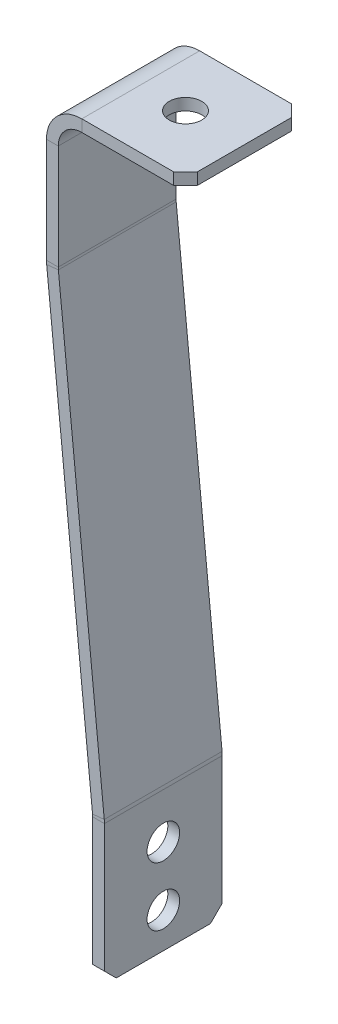
ISO-10303-21;
HEADER;
FILE_DESCRIPTION(('STEP AP214'),'2;1');
FILE_NAME('part.step','',(''),(''),'','','');
FILE_SCHEMA(('AUTOMOTIVE_DESIGN { 1 0 10303 214 1 1 1 1 }'));
ENDSEC;
DATA;
#1=APPLICATION_CONTEXT('core data for automotive mechanical design processes');
#2=APPLICATION_PROTOCOL_DEFINITION('international standard','automotive_design',2000,#1);
#3=PRODUCT_CONTEXT('',#1,'mechanical');
#4=PRODUCT('Part','Part','',(#3));
#5=PRODUCT_RELATED_PRODUCT_CATEGORY('part','',(#4));
#6=PRODUCT_DEFINITION_FORMATION('','',#4);
#7=PRODUCT_DEFINITION_CONTEXT('part definition',#1,'design');
#8=PRODUCT_DEFINITION('design','',#6,#7);
#9=PRODUCT_DEFINITION_SHAPE('','',#8);
#10=(LENGTH_UNIT() NAMED_UNIT(*) SI_UNIT(.MILLI.,.METRE.));
#11=(NAMED_UNIT(*) PLANE_ANGLE_UNIT() SI_UNIT($,.RADIAN.));
#12=(NAMED_UNIT(*) SI_UNIT($,.STERADIAN.) SOLID_ANGLE_UNIT());
#13=UNCERTAINTY_MEASURE_WITH_UNIT(LENGTH_MEASURE(1.E-05),#10,'distance_accuracy_value','');
#14=(GEOMETRIC_REPRESENTATION_CONTEXT(3) GLOBAL_UNCERTAINTY_ASSIGNED_CONTEXT((#13)) GLOBAL_UNIT_ASSIGNED_CONTEXT((#10,
#11,#12)) REPRESENTATION_CONTEXT('',''));
#15=CARTESIAN_POINT('',(0.,0.,0.));
#16=DIRECTION('',(0.,0.,1.));
#17=DIRECTION('',(1.,0.,0.));
#18=AXIS2_PLACEMENT_3D('',#15,#16,#17);
#19=CARTESIAN_POINT('',(-19.6,298.5,50.));
#20=DIRECTION('',(0.,0.,1.));
#21=DIRECTION('',(1.,0.,0.));
#22=AXIS2_PLACEMENT_3D('',#19,#20,#21);
#23=PLANE('',#22);
#24=DIRECTION('',(-1.,0.,0.));
#25=VECTOR('',#24,1.);
#26=CARTESIAN_POINT('',(-19.6,298.5,50.));
#27=LINE('',#26,#25);
#28=CARTESIAN_POINT('',(-19.6,298.5,50.));
#29=VERTEX_POINT('',#28);
#30=CARTESIAN_POINT('',(-24.6,298.5,50.));
#31=VERTEX_POINT('',#30);
#32=EDGE_CURVE('E344',#29,#31,#27,.T.);
#33=ORIENTED_EDGE('',*,*,#32,.F.);
#34=CARTESIAN_POINT('',(-9.60000000000002,298.5,50.));
#35=DIRECTION('',(0.,0.,-1.));
#36=DIRECTION('',(-1.,0.,0.));
#37=AXIS2_PLACEMENT_3D('',#34,#35,#36);
#38=CIRCLE('',#37,10.);
#39=CARTESIAN_POINT('',(-9.60000000000002,308.5,50.));
#40=VERTEX_POINT('',#39);
#41=EDGE_CURVE('E228',#40,#29,#38,.F.);
#42=ORIENTED_EDGE('',*,*,#41,.F.);
#43=DIRECTION('',(0.,-1.,0.));
#44=VECTOR('',#43,1.);
#45=CARTESIAN_POINT('',(-9.60000000000002,313.5,50.));
#46=LINE('',#45,#44);
#47=CARTESIAN_POINT('',(-9.60000000000002,313.5,50.));
#48=VERTEX_POINT('',#47);
#49=EDGE_CURVE('E341',#48,#40,#46,.T.);
#50=ORIENTED_EDGE('',*,*,#49,.F.);
#51=CARTESIAN_POINT('',(-9.60000000000002,298.5,50.));
#52=DIRECTION('',(0.,0.,1.));
#53=DIRECTION('',(1.,0.,0.));
#54=AXIS2_PLACEMENT_3D('',#51,#52,#53);
#55=CIRCLE('',#54,15.);
#56=EDGE_CURVE('E235',#48,#31,#55,.T.);
#57=ORIENTED_EDGE('',*,*,#56,.T.);
#58=EDGE_LOOP('',(#33,#42,#50,#57));
#59=FACE_BOUND('',#58,.T.);
#60=ADVANCED_FACE('F47',(#59),#23,.T.);
#61=CARTESIAN_POINT('',(-9.60000000000002,313.5,50.));
#62=DIRECTION('',(0.,0.,1.));
#63=DIRECTION('',(1.,0.,0.));
#64=AXIS2_PLACEMENT_3D('',#61,#62,#63);
#65=PLANE('',#64);
#66=DIRECTION('',(0.,-1.,0.));
#67=VECTOR('',#66,1.);
#68=CARTESIAN_POINT('',(-19.6,308.5,50.));
#69=LINE('',#68,#67);
#70=CARTESIAN_POINT('',(-19.6,254.005167491933,50.));
#71=VERTEX_POINT('',#70);
#72=EDGE_CURVE('E225',#29,#71,#69,.T.);
#73=ORIENTED_EDGE('',*,*,#72,.F.);
#74=ORIENTED_EDGE('',*,*,#32,.T.);
#75=DIRECTION('',(0.,-1.,0.));
#76=VECTOR('',#75,1.);
#77=CARTESIAN_POINT('',(-24.6,308.5,50.));
#78=LINE('',#77,#76);
#79=CARTESIAN_POINT('',(-24.6,254.005167491933,50.));
#80=VERTEX_POINT('',#79);
#81=EDGE_CURVE('E238',#31,#80,#78,.T.);
#82=ORIENTED_EDGE('',*,*,#81,.T.);
#83=DIRECTION('',(1.,0.,0.));
#84=VECTOR('',#83,1.);
#85=CARTESIAN_POINT('',(-24.6,254.005167491933,50.));
#86=LINE('',#85,#84);
#87=EDGE_CURVE('E332',#80,#71,#86,.T.);
#88=ORIENTED_EDGE('',*,*,#87,.T.);
#89=EDGE_LOOP('',(#73,#74,#82,#88));
#90=FACE_BOUND('',#89,.T.);
#91=ADVANCED_FACE('F493',(#90),#65,.T.);
#92=CARTESIAN_POINT('',(-9.60000000000002,308.5,0.));
#93=DIRECTION('',(0.,0.,-1.));
#94=DIRECTION('',(-1.,0.,0.));
#95=AXIS2_PLACEMENT_3D('',#92,#93,#94);
#96=PLANE('',#95);
#97=DIRECTION('',(0.,1.,0.));
#98=VECTOR('',#97,1.);
#99=CARTESIAN_POINT('',(-9.60000000000002,308.5,0.));
#100=LINE('',#99,#98);
#101=CARTESIAN_POINT('',(-9.60000000000002,308.5,0.));
#102=VERTEX_POINT('',#101);
#103=CARTESIAN_POINT('',(-9.60000000000002,313.5,0.));
#104=VERTEX_POINT('',#103);
#105=EDGE_CURVE('E338',#102,#104,#100,.T.);
#106=ORIENTED_EDGE('',*,*,#105,.F.);
#107=CARTESIAN_POINT('',(-9.60000000000002,298.5,0.));
#108=DIRECTION('',(0.,0.,-1.));
#109=DIRECTION('',(-1.,0.,0.));
#110=AXIS2_PLACEMENT_3D('',#107,#108,#109);
#111=CIRCLE('',#110,10.);
#112=CARTESIAN_POINT('',(-19.6,298.5,0.));
#113=VERTEX_POINT('',#112);
#114=EDGE_CURVE('E265',#102,#113,#111,.F.);
#115=ORIENTED_EDGE('',*,*,#114,.T.);
#116=DIRECTION('',(1.,0.,0.));
#117=VECTOR('',#116,1.);
#118=CARTESIAN_POINT('',(-24.6,298.5,0.));
#119=LINE('',#118,#117);
#120=CARTESIAN_POINT('',(-24.6,298.5,0.));
#121=VERTEX_POINT('',#120);
#122=EDGE_CURVE('E336',#121,#113,#119,.T.);
#123=ORIENTED_EDGE('',*,*,#122,.F.);
#124=CARTESIAN_POINT('',(-9.60000000000002,298.5,0.));
#125=DIRECTION('',(0.,0.,1.));
#126=DIRECTION('',(1.,0.,0.));
#127=AXIS2_PLACEMENT_3D('',#124,#125,#126);
#128=CIRCLE('',#127,15.);
#129=EDGE_CURVE('E272',#104,#121,#128,.T.);
#130=ORIENTED_EDGE('',*,*,#129,.F.);
#131=EDGE_LOOP('',(#106,#115,#123,#130));
#132=FACE_BOUND('',#131,.T.);
#133=ADVANCED_FACE('F457',(#132),#96,.T.);
#134=CARTESIAN_POINT('',(-24.6,298.5,0.));
#135=DIRECTION('',(0.,0.,-1.));
#136=DIRECTION('',(-1.,0.,0.));
#137=AXIS2_PLACEMENT_3D('',#134,#135,#136);
#138=PLANE('',#137);
#139=DIRECTION('',(1.,0.,0.));
#140=VECTOR('',#139,1.);
#141=CARTESIAN_POINT('',(34.4,313.5,0.));
#142=LINE('',#141,#140);
#143=CARTESIAN_POINT('',(29.4,313.5,0.));
#144=VERTEX_POINT('',#143);
#145=EDGE_CURVE('E270',#144,#104,#142,.F.);
#146=ORIENTED_EDGE('',*,*,#145,.F.);
#147=DIRECTION('',(0.,-1.,0.));
#148=VECTOR('',#147,1.);
#149=CARTESIAN_POINT('',(29.4,298.5,0.));
#150=LINE('',#149,#148);
#151=CARTESIAN_POINT('',(29.4,308.5,0.));
#152=VERTEX_POINT('',#151);
#153=EDGE_CURVE('E346',#144,#152,#150,.T.);
#154=ORIENTED_EDGE('',*,*,#153,.T.);
#155=DIRECTION('',(-1.,0.,0.));
#156=VECTOR('',#155,1.);
#157=CARTESIAN_POINT('',(34.4,308.5,0.));
#158=LINE('',#157,#156);
#159=EDGE_CURVE('E268',#152,#102,#158,.T.);
#160=ORIENTED_EDGE('',*,*,#159,.T.);
#161=ORIENTED_EDGE('',*,*,#105,.T.);
#162=EDGE_LOOP('',(#146,#154,#160,#161));
#163=FACE_BOUND('',#162,.T.);
#164=ADVANCED_FACE('F451',(#163),#138,.T.);
#165=CARTESIAN_POINT('',(-19.5490910776334,252.99740426133,50.));
#166=DIRECTION('',(0.,0.,1.));
#167=DIRECTION('',(1.,0.,0.));
#168=AXIS2_PLACEMENT_3D('',#165,#166,#167);
#169=PLANE('',#168);
#170=DIRECTION('',(-0.994909107763343,-0.10077632306027,0.));
#171=VECTOR('',#170,1.);
#172=CARTESIAN_POINT('',(-19.5490910776334,252.99740426133,50.));
#173=LINE('',#172,#171);
#174=CARTESIAN_POINT('',(-19.5490910776334,252.99740426133,50.));
#175=VERTEX_POINT('',#174);
#176=CARTESIAN_POINT('',(-24.5236366164502,252.493522646029,50.));
#177=VERTEX_POINT('',#176);
#178=EDGE_CURVE('E334',#175,#177,#173,.T.);
#179=ORIENTED_EDGE('',*,*,#178,.F.);
#180=CARTESIAN_POINT('',(-9.60000000000002,254.005167491933,50.));
#181=DIRECTION('',(0.,0.,-1.));
#182=DIRECTION('',(-1.,0.,0.));
#183=AXIS2_PLACEMENT_3D('',#180,#181,#182);
#184=CIRCLE('',#183,10.);
#185=EDGE_CURVE('E219',#71,#175,#184,.F.);
#186=ORIENTED_EDGE('',*,*,#185,.F.);
#187=ORIENTED_EDGE('',*,*,#87,.F.);
#188=CARTESIAN_POINT('',(-9.60000000000002,254.005167491933,50.));
#189=DIRECTION('',(0.,0.,1.));
#190=DIRECTION('',(1.,0.,0.));
#191=AXIS2_PLACEMENT_3D('',#188,#189,#190);
#192=CIRCLE('',#191,15.);
#193=EDGE_CURVE('E241',#80,#177,#192,.T.);
#194=ORIENTED_EDGE('',*,*,#193,.T.);
#195=EDGE_LOOP('',(#179,#186,#187,#194));
#196=FACE_BOUND('',#195,.T.);
#197=ADVANCED_FACE('F491',(#196),#169,.T.);
#198=CARTESIAN_POINT('',(-24.6,254.005167491933,50.));
#199=DIRECTION('',(0.,0.,1.));
#200=DIRECTION('',(1.,0.,0.));
#201=AXIS2_PLACEMENT_3D('',#198,#199,#200);
#202=PLANE('',#201);
#203=DIRECTION('',(0.100776323060266,-0.994909107763344,0.));
#204=VECTOR('',#203,1.);
#205=CARTESIAN_POINT('',(-19.6,253.5,50.));
#206=LINE('',#205,#204);
#207=CARTESIAN_POINT('',(-0.0763633835500037,60.7538936080064,50.));
#208=VERTEX_POINT('',#207);
#209=EDGE_CURVE('E217',#175,#208,#206,.T.);
#210=ORIENTED_EDGE('',*,*,#209,.F.);
#211=ORIENTED_EDGE('',*,*,#178,.T.);
#212=DIRECTION('',(0.100776323060266,-0.994909107763344,0.));
#213=VECTOR('',#212,1.);
#214=CARTESIAN_POINT('',(-24.5745455388167,252.996118384699,50.));
#215=LINE('',#214,#213);
#216=CARTESIAN_POINT('',(-5.05090892236665,60.2500119927051,50.));
#217=VERTEX_POINT('',#216);
#218=EDGE_CURVE('E244',#177,#217,#215,.T.);
#219=ORIENTED_EDGE('',*,*,#218,.T.);
#220=DIRECTION('',(0.994909107763344,0.100776323060269,0.));
#221=VECTOR('',#220,1.);
#222=CARTESIAN_POINT('',(-5.05090892236665,60.2500119927051,50.));
#223=LINE('',#222,#221);
#224=EDGE_CURVE('E194',#217,#208,#223,.T.);
#225=ORIENTED_EDGE('',*,*,#224,.T.);
#226=EDGE_LOOP('',(#210,#211,#219,#225));
#227=FACE_BOUND('',#226,.T.);
#228=ADVANCED_FACE('F770',(#227),#202,.T.);
#229=CARTESIAN_POINT('',(-19.6,254.005167491933,0.));
#230=DIRECTION('',(0.,0.,-1.));
#231=DIRECTION('',(-1.,0.,0.));
#232=AXIS2_PLACEMENT_3D('',#229,#230,#231);
#233=PLANE('',#232);
#234=DIRECTION('',(-1.,0.,0.));
#235=VECTOR('',#234,1.);
#236=CARTESIAN_POINT('',(-19.6,254.005167491933,0.));
#237=LINE('',#236,#235);
#238=CARTESIAN_POINT('',(-19.6,254.005167491933,0.));
#239=VERTEX_POINT('',#238);
#240=CARTESIAN_POINT('',(-24.6,254.005167491933,0.));
#241=VERTEX_POINT('',#240);
#242=EDGE_CURVE('E330',#239,#241,#237,.T.);
#243=ORIENTED_EDGE('',*,*,#242,.F.);
#244=CARTESIAN_POINT('',(-9.60000000000002,254.005167491933,0.));
#245=DIRECTION('',(0.,0.,-1.));
#246=DIRECTION('',(-1.,0.,0.));
#247=AXIS2_PLACEMENT_3D('',#244,#245,#246);
#248=CIRCLE('',#247,10.);
#249=CARTESIAN_POINT('',(-19.5490910776334,252.99740426133,0.));
#250=VERTEX_POINT('',#249);
#251=EDGE_CURVE('E259',#239,#250,#248,.F.);
#252=ORIENTED_EDGE('',*,*,#251,.T.);
#253=DIRECTION('',(0.994909107763343,0.10077632306027,0.));
#254=VECTOR('',#253,1.);
#255=CARTESIAN_POINT('',(-24.5236366164502,252.493522646029,0.));
#256=LINE('',#255,#254);
#257=CARTESIAN_POINT('',(-24.5236366164502,252.493522646029,0.));
#258=VERTEX_POINT('',#257);
#259=EDGE_CURVE('E193',#258,#250,#256,.T.);
#260=ORIENTED_EDGE('',*,*,#259,.F.);
#261=CARTESIAN_POINT('',(-9.60000000000002,254.005167491933,0.));
#262=DIRECTION('',(0.,0.,1.));
#263=DIRECTION('',(1.,0.,0.));
#264=AXIS2_PLACEMENT_3D('',#261,#262,#263);
#265=CIRCLE('',#264,15.);
#266=EDGE_CURVE('E278',#241,#258,#265,.T.);
#267=ORIENTED_EDGE('',*,*,#266,.F.);
#268=EDGE_LOOP('',(#243,#252,#260,#267));
#269=FACE_BOUND('',#268,.T.);
#270=ADVANCED_FACE('F479',(#269),#233,.T.);
#271=CARTESIAN_POINT('',(-24.5236366164502,252.493522646029,0.));
#272=DIRECTION('',(0.,0.,-1.));
#273=DIRECTION('',(-1.,0.,0.));
#274=AXIS2_PLACEMENT_3D('',#271,#272,#273);
#275=PLANE('',#274);
#276=DIRECTION('',(0.,-1.,0.));
#277=VECTOR('',#276,1.);
#278=CARTESIAN_POINT('',(-19.6,308.5,0.));
#279=LINE('',#278,#277);
#280=EDGE_CURVE('E262',#113,#239,#279,.T.);
#281=ORIENTED_EDGE('',*,*,#280,.T.);
#282=ORIENTED_EDGE('',*,*,#242,.T.);
#283=DIRECTION('',(0.,-1.,0.));
#284=VECTOR('',#283,1.);
#285=CARTESIAN_POINT('',(-24.6,308.5,0.));
#286=LINE('',#285,#284);
#287=EDGE_CURVE('E275',#121,#241,#286,.T.);
#288=ORIENTED_EDGE('',*,*,#287,.F.);
#289=ORIENTED_EDGE('',*,*,#122,.T.);
#290=EDGE_LOOP('',(#281,#282,#288,#289));
#291=FACE_BOUND('',#290,.T.);
#292=ADVANCED_FACE('F461',(#291),#275,.T.);
#293=CARTESIAN_POINT('',(0.,59.2422487621024,50.));
#294=DIRECTION('',(0.,0.,1.));
#295=DIRECTION('',(1.,0.,0.));
#296=AXIS2_PLACEMENT_3D('',#293,#294,#295);
#297=PLANE('',#296);
#298=DIRECTION('',(-1.,0.,0.));
#299=VECTOR('',#298,1.);
#300=CARTESIAN_POINT('',(0.,59.2422487621024,50.));
#301=LINE('',#300,#299);
#302=CARTESIAN_POINT('',(0.,59.2422487621024,50.));
#303=VERTEX_POINT('',#302);
#304=CARTESIAN_POINT('',(-5.,59.2422487621024,50.));
#305=VERTEX_POINT('',#304);
#306=EDGE_CURVE('E184',#303,#305,#301,.T.);
#307=ORIENTED_EDGE('',*,*,#306,.F.);
#308=CARTESIAN_POINT('',(-15.0000000000001,59.2422487621024,50.));
#309=DIRECTION('',(0.,0.,1.));
#310=DIRECTION('',(1.,0.,0.));
#311=AXIS2_PLACEMENT_3D('',#308,#309,#310);
#312=CIRCLE('',#311,15.);
#313=EDGE_CURVE('E188',#208,#303,#312,.F.);
#314=ORIENTED_EDGE('',*,*,#313,.F.);
#315=ORIENTED_EDGE('',*,*,#224,.F.);
#316=CARTESIAN_POINT('',(-15.0000000000001,59.2422487621024,50.));
#317=DIRECTION('',(0.,0.,1.));
#318=DIRECTION('',(1.,0.,0.));
#319=AXIS2_PLACEMENT_3D('',#316,#317,#318);
#320=CIRCLE('',#319,10.);
#321=EDGE_CURVE('E191',#217,#305,#320,.F.);
#322=ORIENTED_EDGE('',*,*,#321,.T.);
#323=EDGE_LOOP('',(#307,#314,#315,#322));
#324=FACE_BOUND('',#323,.T.);
#325=ADVANCED_FACE('F186',(#324),#297,.T.);
#326=CARTESIAN_POINT('',(-5.05090892236665,60.2500119927051,50.));
#327=DIRECTION('',(0.,0.,1.));
#328=DIRECTION('',(1.,0.,0.));
#329=AXIS2_PLACEMENT_3D('',#326,#327,#328);
#330=PLANE('',#329);
#331=DIRECTION('',(0.,-1.,0.));
#332=VECTOR('',#331,1.);
#333=CARTESIAN_POINT('',(-5.,60.,50.));
#334=LINE('',#333,#332);
#335=CARTESIAN_POINT('',(-5.,5.,50.));
#336=VERTEX_POINT('',#335);
#337=EDGE_CURVE('E212',#305,#336,#334,.T.);
#338=ORIENTED_EDGE('',*,*,#337,.T.);
#339=DIRECTION('',(1.,0.,0.));
#340=VECTOR('',#339,1.);
#341=CARTESIAN_POINT('',(-5.05090892236665,5.,50.));
#342=LINE('',#341,#340);
#343=CARTESIAN_POINT('',(0.,5.,50.));
#344=VERTEX_POINT('',#343);
#345=EDGE_CURVE('E55',#336,#344,#342,.T.);
#346=ORIENTED_EDGE('',*,*,#345,.T.);
#347=DIRECTION('',(0.,-1.,0.));
#348=VECTOR('',#347,1.);
#349=CARTESIAN_POINT('',(0.,60.,50.));
#350=LINE('',#349,#348);
#351=EDGE_CURVE('E201',#303,#344,#350,.T.);
#352=ORIENTED_EDGE('',*,*,#351,.F.);
#353=ORIENTED_EDGE('',*,*,#306,.T.);
#354=EDGE_LOOP('',(#338,#346,#352,#353));
#355=FACE_BOUND('',#354,.T.);
#356=ADVANCED_FACE('F211',(#355),#330,.T.);
#357=CARTESIAN_POINT('',(-0.0763633835500037,60.7538936080064,0.));
#358=DIRECTION('',(0.,0.,-1.));
#359=DIRECTION('',(-1.,0.,0.));
#360=AXIS2_PLACEMENT_3D('',#357,#358,#359);
#361=PLANE('',#360);
#362=DIRECTION('',(-0.994909107763344,-0.100776323060269,0.));
#363=VECTOR('',#362,1.);
#364=CARTESIAN_POINT('',(-0.0763633835500037,60.7538936080064,0.));
#365=LINE('',#364,#363);
#366=CARTESIAN_POINT('',(-0.0763633835500037,60.7538936080064,0.));
#367=VERTEX_POINT('',#366);
#368=CARTESIAN_POINT('',(-5.05090892236665,60.2500119927051,0.));
#369=VERTEX_POINT('',#368);
#370=EDGE_CURVE('E326',#367,#369,#365,.T.);
#371=ORIENTED_EDGE('',*,*,#370,.F.);
#372=CARTESIAN_POINT('',(-15.0000000000001,59.2422487621024,0.));
#373=DIRECTION('',(0.,0.,1.));
#374=DIRECTION('',(1.,0.,0.));
#375=AXIS2_PLACEMENT_3D('',#372,#373,#374);
#376=CIRCLE('',#375,15.);
#377=CARTESIAN_POINT('',(0.,59.2422487621024,0.));
#378=VERTEX_POINT('',#377);
#379=EDGE_CURVE('E254',#367,#378,#376,.F.);
#380=ORIENTED_EDGE('',*,*,#379,.T.);
#381=DIRECTION('',(1.,0.,0.));
#382=VECTOR('',#381,1.);
#383=CARTESIAN_POINT('',(-5.,59.2422487621024,0.));
#384=LINE('',#383,#382);
#385=CARTESIAN_POINT('',(-5.,59.2422487621024,0.));
#386=VERTEX_POINT('',#385);
#387=EDGE_CURVE('E324',#386,#378,#384,.T.);
#388=ORIENTED_EDGE('',*,*,#387,.F.);
#389=CARTESIAN_POINT('',(-15.0000000000001,59.2422487621024,0.));
#390=DIRECTION('',(0.,0.,1.));
#391=DIRECTION('',(1.,0.,0.));
#392=AXIS2_PLACEMENT_3D('',#389,#390,#391);
#393=CIRCLE('',#392,10.);
#394=EDGE_CURVE('E284',#369,#386,#393,.F.);
#395=ORIENTED_EDGE('',*,*,#394,.F.);
#396=EDGE_LOOP('',(#371,#380,#388,#395));
#397=FACE_BOUND('',#396,.T.);
#398=ADVANCED_FACE('F402',(#397),#361,.T.);
#399=CARTESIAN_POINT('',(-5.,59.2422487621024,0.));
#400=DIRECTION('',(0.,0.,-1.));
#401=DIRECTION('',(-1.,0.,0.));
#402=AXIS2_PLACEMENT_3D('',#399,#400,#401);
#403=PLANE('',#402);
#404=DIRECTION('',(0.100776323060266,-0.994909107763344,0.));
#405=VECTOR('',#404,1.);
#406=CARTESIAN_POINT('',(-19.6,253.5,0.));
#407=LINE('',#406,#405);
#408=EDGE_CURVE('E256',#250,#367,#407,.T.);
#409=ORIENTED_EDGE('',*,*,#408,.T.);
#410=ORIENTED_EDGE('',*,*,#370,.T.);
#411=DIRECTION('',(0.100776323060266,-0.994909107763344,0.));
#412=VECTOR('',#411,1.);
#413=CARTESIAN_POINT('',(-24.5745455388167,252.996118384699,0.));
#414=LINE('',#413,#412);
#415=EDGE_CURVE('E281',#258,#369,#414,.T.);
#416=ORIENTED_EDGE('',*,*,#415,.F.);
#417=ORIENTED_EDGE('',*,*,#259,.T.);
#418=EDGE_LOOP('',(#409,#410,#416,#417));
#419=FACE_BOUND('',#418,.T.);
#420=ADVANCED_FACE('F720',(#419),#403,.T.);
#421=CARTESIAN_POINT('',(-5.,60.,50.));
#422=DIRECTION('',(1.,0.,0.));
#423=DIRECTION('',(0.,1.,0.));
#424=AXIS2_PLACEMENT_3D('',#421,#422,#423);
#425=PLANE('',#424);
#426=CARTESIAN_POINT('',(-5.,15.,25.));
#427=DIRECTION('',(-1.,0.,0.));
#428=DIRECTION('',(0.,-1.,0.));
#429=AXIS2_PLACEMENT_3D('',#426,#427,#428);
#430=CIRCLE('',#429,6.90000000000001);
#431=CARTESIAN_POINT('',(-5.,8.09999999999999,25.));
#432=VERTEX_POINT('',#431);
#433=EDGE_CURVE('E350',#432,#432,#430,.T.);
#434=ORIENTED_EDGE('',*,*,#433,.F.);
#435=EDGE_LOOP('',(#434));
#436=FACE_BOUND('',#435,.T.);
#437=CARTESIAN_POINT('',(-5.,40.,25.));
#438=DIRECTION('',(-1.,0.,0.));
#439=DIRECTION('',(0.,-1.,0.));
#440=AXIS2_PLACEMENT_3D('',#437,#438,#439);
#441=CIRCLE('',#440,6.90000000000001);
#442=CARTESIAN_POINT('',(-5.,33.1,25.));
#443=VERTEX_POINT('',#442);
#444=EDGE_CURVE('E407',#443,#443,#441,.T.);
#445=ORIENTED_EDGE('',*,*,#444,.F.);
#446=EDGE_LOOP('',(#445));
#447=FACE_BOUND('',#446,.T.);
#448=DIRECTION('',(0.,0.,-1.));
#449=VECTOR('',#448,1.);
#450=CARTESIAN_POINT('',(-5.,0.,50.));
#451=LINE('',#450,#449);
#452=CARTESIAN_POINT('',(-5.,0.,45.));
#453=VERTEX_POINT('',#452);
#454=CARTESIAN_POINT('',(-5.,0.,5.));
#455=VERTEX_POINT('',#454);
#456=EDGE_CURVE('E322',#453,#455,#451,.T.);
#457=ORIENTED_EDGE('',*,*,#456,.F.);
#458=DIRECTION('',(0.,-0.707106781186548,-0.707106781186548));
#459=VECTOR('',#458,1.);
#460=CARTESIAN_POINT('',(-5.,0.,45.));
#461=LINE('',#460,#459);
#462=EDGE_CURVE('E69',#453,#336,#461,.F.);
#463=ORIENTED_EDGE('',*,*,#462,.T.);
#464=ORIENTED_EDGE('',*,*,#337,.F.);
#465=DIRECTION('',(0.,0.,-1.));
#466=VECTOR('',#465,1.);
#467=CARTESIAN_POINT('',(-5.,59.2422487621024,50.));
#468=LINE('',#467,#466);
#469=EDGE_CURVE('E248',#305,#386,#468,.T.);
#470=ORIENTED_EDGE('',*,*,#469,.T.);
#471=DIRECTION('',(0.,-1.,0.));
#472=VECTOR('',#471,1.);
#473=CARTESIAN_POINT('',(-5.,60.,0.));
#474=LINE('',#473,#472);
#475=CARTESIAN_POINT('',(-5.,5.,0.));
#476=VERTEX_POINT('',#475);
#477=EDGE_CURVE('E249',#386,#476,#474,.T.);
#478=ORIENTED_EDGE('',*,*,#477,.T.);
#479=DIRECTION('',(0.,-0.707106781186548,0.707106781186548));
#480=VECTOR('',#479,1.);
#481=CARTESIAN_POINT('',(-5.,5.,0.));
#482=LINE('',#481,#480);
#483=EDGE_CURVE('E375',#476,#455,#482,.T.);
#484=ORIENTED_EDGE('',*,*,#483,.T.);
#485=EDGE_LOOP('',(#457,#463,#464,#470,#478,#484));
#486=FACE_BOUND('',#485,.T.);
#487=ADVANCED_FACE('F391',(#436,#447,#486),#425,.F.);
#488=CARTESIAN_POINT('',(0.,0.,50.));
#489=DIRECTION('',(0.,-1.,0.));
#490=DIRECTION('',(0.,0.,-1.));
#491=AXIS2_PLACEMENT_3D('',#488,#489,#490);
#492=PLANE('',#491);
#493=DIRECTION('',(0.,0.,-1.));
#494=VECTOR('',#493,1.);
#495=CARTESIAN_POINT('',(0.,0.,50.));
#496=LINE('',#495,#494);
#497=CARTESIAN_POINT('',(0.,0.,45.));
#498=VERTEX_POINT('',#497);
#499=CARTESIAN_POINT('',(0.,0.,5.));
#500=VERTEX_POINT('',#499);
#501=EDGE_CURVE('E208',#498,#500,#496,.T.);
#502=ORIENTED_EDGE('',*,*,#501,.F.);
#503=DIRECTION('',(-1.,0.,0.));
#504=VECTOR('',#503,1.);
#505=CARTESIAN_POINT('',(0.,0.,45.));
#506=LINE('',#505,#504);
#507=EDGE_CURVE('E383',#498,#453,#506,.T.);
#508=ORIENTED_EDGE('',*,*,#507,.T.);
#509=ORIENTED_EDGE('',*,*,#456,.T.);
#510=DIRECTION('',(1.,0.,0.));
#511=VECTOR('',#510,1.);
#512=CARTESIAN_POINT('',(0.,0.,5.));
#513=LINE('',#512,#511);
#514=EDGE_CURVE('E378',#455,#500,#513,.T.);
#515=ORIENTED_EDGE('',*,*,#514,.T.);
#516=EDGE_LOOP('',(#502,#508,#509,#515));
#517=FACE_BOUND('',#516,.T.);
#518=ADVANCED_FACE('F389',(#517),#492,.T.);
#519=CARTESIAN_POINT('',(0.,60.,50.));
#520=DIRECTION('',(1.,0.,0.));
#521=DIRECTION('',(0.,1.,0.));
#522=AXIS2_PLACEMENT_3D('',#519,#520,#521);
#523=PLANE('',#522);
#524=CARTESIAN_POINT('',(0.,15.,25.));
#525=DIRECTION('',(1.,0.,0.));
#526=DIRECTION('',(0.,1.,0.));
#527=AXIS2_PLACEMENT_3D('',#524,#525,#526);
#528=CIRCLE('',#527,6.90000000000001);
#529=CARTESIAN_POINT('',(0.,21.9,25.));
#530=VERTEX_POINT('',#529);
#531=EDGE_CURVE('E252',#530,#530,#528,.T.);
#532=ORIENTED_EDGE('',*,*,#531,.F.);
#533=EDGE_LOOP('',(#532));
#534=FACE_BOUND('',#533,.T.);
#535=CARTESIAN_POINT('',(0.,40.,25.));
#536=DIRECTION('',(1.,0.,0.));
#537=DIRECTION('',(0.,1.,0.));
#538=AXIS2_PLACEMENT_3D('',#535,#536,#537);
#539=CIRCLE('',#538,6.90000000000001);
#540=CARTESIAN_POINT('',(0.,46.9,25.));
#541=VERTEX_POINT('',#540);
#542=EDGE_CURVE('E347',#541,#541,#539,.T.);
#543=ORIENTED_EDGE('',*,*,#542,.F.);
#544=EDGE_LOOP('',(#543));
#545=FACE_BOUND('',#544,.T.);
#546=ORIENTED_EDGE('',*,*,#351,.T.);
#547=DIRECTION('',(0.,0.707106781186548,0.707106781186548));
#548=VECTOR('',#547,1.);
#549=CARTESIAN_POINT('',(0.,32.5,77.5));
#550=LINE('',#549,#548);
#551=EDGE_CURVE('E11',#344,#498,#550,.F.);
#552=ORIENTED_EDGE('',*,*,#551,.T.);
#553=ORIENTED_EDGE('',*,*,#501,.T.);
#554=DIRECTION('',(0.,0.707106781186548,-0.707106781186548));
#555=VECTOR('',#554,1.);
#556=CARTESIAN_POINT('',(0.,7.50000000000001,-2.49999999999999));
#557=LINE('',#556,#555);
#558=CARTESIAN_POINT('',(0.,5.,0.));
#559=VERTEX_POINT('',#558);
#560=EDGE_CURVE('E381',#500,#559,#557,.T.);
#561=ORIENTED_EDGE('',*,*,#560,.T.);
#562=DIRECTION('',(0.,-1.,0.));
#563=VECTOR('',#562,1.);
#564=CARTESIAN_POINT('',(0.,60.,0.));
#565=LINE('',#564,#563);
#566=EDGE_CURVE('E204',#378,#559,#565,.T.);
#567=ORIENTED_EDGE('',*,*,#566,.F.);
#568=DIRECTION('',(0.,0.,-1.));
#569=VECTOR('',#568,1.);
#570=CARTESIAN_POINT('',(0.,59.2422487621024,50.));
#571=LINE('',#570,#569);
#572=EDGE_CURVE('E199',#303,#378,#571,.T.);
#573=ORIENTED_EDGE('',*,*,#572,.F.);
#574=EDGE_LOOP('',(#546,#552,#553,#561,#567,#573));
#575=FACE_BOUND('',#574,.T.);
#576=ADVANCED_FACE('F200',(#534,#545,#575),#523,.T.);
#577=CARTESIAN_POINT('',(-15.0000000000001,59.2422487621024,50.));
#578=DIRECTION('',(0.,0.,-1.));
#579=DIRECTION('',(-1.,0.,0.));
#580=AXIS2_PLACEMENT_3D('',#577,#578,#579);
#581=CYLINDRICAL_SURFACE('',#580,15.);
#582=ORIENTED_EDGE('',*,*,#379,.F.);
#583=DIRECTION('',(0.,0.,-1.));
#584=VECTOR('',#583,1.);
#585=CARTESIAN_POINT('',(-0.0763633835500037,60.7538936080064,50.));
#586=LINE('',#585,#584);
#587=EDGE_CURVE('E209',#208,#367,#586,.T.);
#588=ORIENTED_EDGE('',*,*,#587,.F.);
#589=ORIENTED_EDGE('',*,*,#313,.T.);
#590=ORIENTED_EDGE('',*,*,#572,.T.);
#591=EDGE_LOOP('',(#582,#588,#589,#590));
#592=FACE_BOUND('',#591,.T.);
#593=ADVANCED_FACE('F215',(#592),#581,.T.);
#594=CARTESIAN_POINT('',(-19.6,253.5,50.));
#595=DIRECTION('',(0.994909107763344,0.100776323060266,0.));
#596=DIRECTION('',(-0.100776323060266,0.994909107763344,0.));
#597=AXIS2_PLACEMENT_3D('',#594,#595,#596);
#598=PLANE('',#597);
#599=ORIENTED_EDGE('',*,*,#408,.F.);
#600=DIRECTION('',(0.,0.,-1.));
#601=VECTOR('',#600,1.);
#602=CARTESIAN_POINT('',(-19.5490910776334,252.99740426133,50.));
#603=LINE('',#602,#601);
#604=EDGE_CURVE('E317',#175,#250,#603,.T.);
#605=ORIENTED_EDGE('',*,*,#604,.F.);
#606=ORIENTED_EDGE('',*,*,#209,.T.);
#607=ORIENTED_EDGE('',*,*,#587,.T.);
#608=EDGE_LOOP('',(#599,#605,#606,#607));
#609=FACE_BOUND('',#608,.T.);
#610=ADVANCED_FACE('F676',(#609),#598,.T.);
#611=CARTESIAN_POINT('',(-9.60000000000002,254.005167491933,50.));
#612=DIRECTION('',(0.,0.,-1.));
#613=DIRECTION('',(-1.,0.,0.));
#614=AXIS2_PLACEMENT_3D('',#611,#612,#613);
#615=CYLINDRICAL_SURFACE('',#614,10.);
#616=ORIENTED_EDGE('',*,*,#251,.F.);
#617=DIRECTION('',(0.,0.,-1.));
#618=VECTOR('',#617,1.);
#619=CARTESIAN_POINT('',(-19.6,254.005167491933,50.));
#620=LINE('',#619,#618);
#621=EDGE_CURVE('E314',#71,#239,#620,.T.);
#622=ORIENTED_EDGE('',*,*,#621,.F.);
#623=ORIENTED_EDGE('',*,*,#185,.T.);
#624=ORIENTED_EDGE('',*,*,#604,.T.);
#625=EDGE_LOOP('',(#616,#622,#623,#624));
#626=FACE_BOUND('',#625,.T.);
#627=ADVANCED_FACE('F475',(#626),#615,.F.);
#628=CARTESIAN_POINT('',(-19.6,308.5,50.));
#629=DIRECTION('',(1.,0.,0.));
#630=DIRECTION('',(0.,1.,0.));
#631=AXIS2_PLACEMENT_3D('',#628,#629,#630);
#632=PLANE('',#631);
#633=ORIENTED_EDGE('',*,*,#280,.F.);
#634=DIRECTION('',(0.,0.,-1.));
#635=VECTOR('',#634,1.);
#636=CARTESIAN_POINT('',(-19.6,298.5,50.));
#637=LINE('',#636,#635);
#638=EDGE_CURVE('E311',#29,#113,#637,.T.);
#639=ORIENTED_EDGE('',*,*,#638,.F.);
#640=ORIENTED_EDGE('',*,*,#72,.T.);
#641=ORIENTED_EDGE('',*,*,#621,.T.);
#642=EDGE_LOOP('',(#633,#639,#640,#641));
#643=FACE_BOUND('',#642,.T.);
#644=ADVANCED_FACE('F470',(#643),#632,.T.);
#645=CARTESIAN_POINT('',(-9.60000000000002,298.5,50.));
#646=DIRECTION('',(0.,0.,-1.));
#647=DIRECTION('',(-1.,0.,0.));
#648=AXIS2_PLACEMENT_3D('',#645,#646,#647);
#649=CYLINDRICAL_SURFACE('',#648,10.);
#650=ORIENTED_EDGE('',*,*,#114,.F.);
#651=DIRECTION('',(0.,0.,-1.));
#652=VECTOR('',#651,1.);
#653=CARTESIAN_POINT('',(-9.60000000000002,308.5,50.));
#654=LINE('',#653,#652);
#655=EDGE_CURVE('E308',#40,#102,#654,.T.);
#656=ORIENTED_EDGE('',*,*,#655,.F.);
#657=ORIENTED_EDGE('',*,*,#41,.T.);
#658=ORIENTED_EDGE('',*,*,#638,.T.);
#659=EDGE_LOOP('',(#650,#656,#657,#658));
#660=FACE_BOUND('',#659,.T.);
#661=ADVANCED_FACE('F465',(#660),#649,.F.);
#662=CARTESIAN_POINT('',(34.4,308.5,50.));
#663=DIRECTION('',(0.,-1.,0.));
#664=DIRECTION('',(0.,0.,-1.));
#665=AXIS2_PLACEMENT_3D('',#662,#663,#664);
#666=PLANE('',#665);
#667=CARTESIAN_POINT('',(9.39999999999996,308.5,25.));
#668=DIRECTION('',(0.,-1.,0.));
#669=DIRECTION('',(0.,0.,-1.));
#670=AXIS2_PLACEMENT_3D('',#667,#668,#669);
#671=CIRCLE('',#670,6.9);
#672=CARTESIAN_POINT('',(9.39999999999996,308.5,18.1));
#673=VERTEX_POINT('',#672);
#674=EDGE_CURVE('E410',#673,#673,#671,.T.);
#675=ORIENTED_EDGE('',*,*,#674,.F.);
#676=EDGE_LOOP('',(#675));
#677=FACE_BOUND('',#676,.T.);
#678=DIRECTION('',(0.,0.,-1.));
#679=VECTOR('',#678,1.);
#680=CARTESIAN_POINT('',(34.4,308.5,50.));
#681=LINE('',#680,#679);
#682=CARTESIAN_POINT('',(34.4,308.5,45.));
#683=VERTEX_POINT('',#682);
#684=CARTESIAN_POINT('',(34.4,308.5,5.));
#685=VERTEX_POINT('',#684);
#686=EDGE_CURVE('E306',#683,#685,#681,.T.);
#687=ORIENTED_EDGE('',*,*,#686,.F.);
#688=DIRECTION('',(0.707106781186548,0.,-0.707106781186547));
#689=VECTOR('',#688,1.);
#690=CARTESIAN_POINT('',(31.9,308.5,47.5));
#691=LINE('',#690,#689);
#692=CARTESIAN_POINT('',(29.4,308.5,50.));
#693=VERTEX_POINT('',#692);
#694=EDGE_CURVE('E366',#683,#693,#691,.F.);
#695=ORIENTED_EDGE('',*,*,#694,.T.);
#696=DIRECTION('',(-1.,0.,0.));
#697=VECTOR('',#696,1.);
#698=CARTESIAN_POINT('',(34.4,308.5,50.));
#699=LINE('',#698,#697);
#700=EDGE_CURVE('E231',#693,#40,#699,.T.);
#701=ORIENTED_EDGE('',*,*,#700,.T.);
#702=ORIENTED_EDGE('',*,*,#655,.T.);
#703=ORIENTED_EDGE('',*,*,#159,.F.);
#704=DIRECTION('',(-0.707106781186548,0.,-0.707106781186547));
#705=VECTOR('',#704,1.);
#706=CARTESIAN_POINT('',(56.9,308.5,27.5));
#707=LINE('',#706,#705);
#708=EDGE_CURVE('E355',#152,#685,#707,.F.);
#709=ORIENTED_EDGE('',*,*,#708,.T.);
#710=EDGE_LOOP('',(#687,#695,#701,#702,#703,#709));
#711=FACE_BOUND('',#710,.T.);
#712=ADVANCED_FACE('F441',(#677,#711),#666,.T.);
#713=CARTESIAN_POINT('',(34.4,313.5,50.));
#714=DIRECTION('',(1.,0.,0.));
#715=DIRECTION('',(0.,0.,-1.));
#716=AXIS2_PLACEMENT_3D('',#713,#714,#715);
#717=PLANE('',#716);
#718=DIRECTION('',(0.,0.,-1.));
#719=VECTOR('',#718,1.);
#720=CARTESIAN_POINT('',(34.4,313.5,50.));
#721=LINE('',#720,#719);
#722=CARTESIAN_POINT('',(34.4,313.5,45.));
#723=VERTEX_POINT('',#722);
#724=CARTESIAN_POINT('',(34.4,313.5,5.));
#725=VERTEX_POINT('',#724);
#726=EDGE_CURVE('E304',#723,#725,#721,.T.);
#727=ORIENTED_EDGE('',*,*,#726,.F.);
#728=DIRECTION('',(0.,-1.,0.));
#729=VECTOR('',#728,1.);
#730=CARTESIAN_POINT('',(34.4,313.5,45.));
#731=LINE('',#730,#729);
#732=EDGE_CURVE('E363',#723,#683,#731,.T.);
#733=ORIENTED_EDGE('',*,*,#732,.T.);
#734=ORIENTED_EDGE('',*,*,#686,.T.);
#735=DIRECTION('',(0.,1.,0.));
#736=VECTOR('',#735,1.);
#737=CARTESIAN_POINT('',(34.4,313.5,5.));
#738=LINE('',#737,#736);
#739=EDGE_CURVE('E358',#685,#725,#738,.T.);
#740=ORIENTED_EDGE('',*,*,#739,.T.);
#741=EDGE_LOOP('',(#727,#733,#734,#740));
#742=FACE_BOUND('',#741,.T.);
#743=ADVANCED_FACE('F425',(#742),#717,.T.);
#744=CARTESIAN_POINT('',(34.4,313.5,50.));
#745=DIRECTION('',(0.,-1.,0.));
#746=DIRECTION('',(0.,0.,-1.));
#747=AXIS2_PLACEMENT_3D('',#744,#745,#746);
#748=PLANE('',#747);
#749=CARTESIAN_POINT('',(9.39999999999997,313.5,25.));
#750=DIRECTION('',(0.,1.,0.));
#751=DIRECTION('',(-1.,0.,0.));
#752=AXIS2_PLACEMENT_3D('',#749,#750,#751);
#753=CIRCLE('',#752,6.9);
#754=CARTESIAN_POINT('',(2.49999999999997,313.5,25.));
#755=VERTEX_POINT('',#754);
#756=EDGE_CURVE('E415',#755,#755,#753,.T.);
#757=ORIENTED_EDGE('',*,*,#756,.F.);
#758=EDGE_LOOP('',(#757));
#759=FACE_BOUND('',#758,.T.);
#760=DIRECTION('',(1.,0.,0.));
#761=VECTOR('',#760,1.);
#762=CARTESIAN_POINT('',(34.4,313.5,50.));
#763=LINE('',#762,#761);
#764=CARTESIAN_POINT('',(29.4,313.5,50.));
#765=VERTEX_POINT('',#764);
#766=EDGE_CURVE('E233',#765,#48,#763,.F.);
#767=ORIENTED_EDGE('',*,*,#766,.F.);
#768=DIRECTION('',(-0.707106781186548,0.,0.707106781186547));
#769=VECTOR('',#768,1.);
#770=CARTESIAN_POINT('',(34.4,313.5,45.));
#771=LINE('',#770,#769);
#772=EDGE_CURVE('E370',#765,#723,#771,.F.);
#773=ORIENTED_EDGE('',*,*,#772,.T.);
#774=ORIENTED_EDGE('',*,*,#726,.T.);
#775=DIRECTION('',(0.707106781186548,0.,0.707106781186547));
#776=VECTOR('',#775,1.);
#777=CARTESIAN_POINT('',(29.4,313.5,0.));
#778=LINE('',#777,#776);
#779=EDGE_CURVE('E361',#725,#144,#778,.F.);
#780=ORIENTED_EDGE('',*,*,#779,.T.);
#781=ORIENTED_EDGE('',*,*,#145,.T.);
#782=DIRECTION('',(0.,0.,-1.));
#783=VECTOR('',#782,1.);
#784=CARTESIAN_POINT('',(-9.60000000000002,313.5,50.));
#785=LINE('',#784,#783);
#786=EDGE_CURVE('E301',#48,#104,#785,.T.);
#787=ORIENTED_EDGE('',*,*,#786,.F.);
#788=EDGE_LOOP('',(#767,#773,#774,#780,#781,#787));
#789=FACE_BOUND('',#788,.T.);
#790=ADVANCED_FACE('F421',(#759,#789),#748,.F.);
#791=CARTESIAN_POINT('',(-9.60000000000002,298.5,50.));
#792=DIRECTION('',(0.,0.,-1.));
#793=DIRECTION('',(-1.,0.,0.));
#794=AXIS2_PLACEMENT_3D('',#791,#792,#793);
#795=CYLINDRICAL_SURFACE('',#794,15.);
#796=ORIENTED_EDGE('',*,*,#129,.T.);
#797=DIRECTION('',(0.,0.,-1.));
#798=VECTOR('',#797,1.);
#799=CARTESIAN_POINT('',(-24.6,298.5,50.));
#800=LINE('',#799,#798);
#801=EDGE_CURVE('E298',#31,#121,#800,.T.);
#802=ORIENTED_EDGE('',*,*,#801,.F.);
#803=ORIENTED_EDGE('',*,*,#56,.F.);
#804=ORIENTED_EDGE('',*,*,#786,.T.);
#805=EDGE_LOOP('',(#796,#802,#803,#804));
#806=FACE_BOUND('',#805,.T.);
#807=ADVANCED_FACE('F424',(#806),#795,.T.);
#808=CARTESIAN_POINT('',(-24.6,308.5,50.));
#809=DIRECTION('',(1.,0.,0.));
#810=DIRECTION('',(0.,1.,0.));
#811=AXIS2_PLACEMENT_3D('',#808,#809,#810);
#812=PLANE('',#811);
#813=ORIENTED_EDGE('',*,*,#287,.T.);
#814=DIRECTION('',(0.,0.,-1.));
#815=VECTOR('',#814,1.);
#816=CARTESIAN_POINT('',(-24.6,254.005167491933,50.));
#817=LINE('',#816,#815);
#818=EDGE_CURVE('E295',#80,#241,#817,.T.);
#819=ORIENTED_EDGE('',*,*,#818,.F.);
#820=ORIENTED_EDGE('',*,*,#81,.F.);
#821=ORIENTED_EDGE('',*,*,#801,.T.);
#822=EDGE_LOOP('',(#813,#819,#820,#821));
#823=FACE_BOUND('',#822,.T.);
#824=ADVANCED_FACE('F483',(#823),#812,.F.);
#825=CARTESIAN_POINT('',(-9.60000000000002,254.005167491933,50.));
#826=DIRECTION('',(0.,0.,-1.));
#827=DIRECTION('',(-1.,0.,0.));
#828=AXIS2_PLACEMENT_3D('',#825,#826,#827);
#829=CYLINDRICAL_SURFACE('',#828,15.);
#830=ORIENTED_EDGE('',*,*,#266,.T.);
#831=DIRECTION('',(0.,0.,-1.));
#832=VECTOR('',#831,1.);
#833=CARTESIAN_POINT('',(-24.5236366164502,252.493522646029,50.));
#834=LINE('',#833,#832);
#835=EDGE_CURVE('E292',#177,#258,#834,.T.);
#836=ORIENTED_EDGE('',*,*,#835,.F.);
#837=ORIENTED_EDGE('',*,*,#193,.F.);
#838=ORIENTED_EDGE('',*,*,#818,.T.);
#839=EDGE_LOOP('',(#830,#836,#837,#838));
#840=FACE_BOUND('',#839,.T.);
#841=ADVANCED_FACE('F487',(#840),#829,.T.);
#842=CARTESIAN_POINT('',(-24.5745455388167,252.996118384699,50.));
#843=DIRECTION('',(0.994909107763344,0.100776323060266,0.));
#844=DIRECTION('',(-0.100776323060266,0.994909107763344,0.));
#845=AXIS2_PLACEMENT_3D('',#842,#843,#844);
#846=PLANE('',#845);
#847=ORIENTED_EDGE('',*,*,#415,.T.);
#848=DIRECTION('',(0.,0.,-1.));
#849=VECTOR('',#848,1.);
#850=CARTESIAN_POINT('',(-5.05090892236665,60.2500119927051,50.));
#851=LINE('',#850,#849);
#852=EDGE_CURVE('E289',#217,#369,#851,.T.);
#853=ORIENTED_EDGE('',*,*,#852,.F.);
#854=ORIENTED_EDGE('',*,*,#218,.F.);
#855=ORIENTED_EDGE('',*,*,#835,.T.);
#856=EDGE_LOOP('',(#847,#853,#854,#855));
#857=FACE_BOUND('',#856,.T.);
#858=ADVANCED_FACE('F504',(#857),#846,.F.);
#859=CARTESIAN_POINT('',(-15.0000000000001,59.2422487621024,50.));
#860=DIRECTION('',(0.,0.,-1.));
#861=DIRECTION('',(-1.,0.,0.));
#862=AXIS2_PLACEMENT_3D('',#859,#860,#861);
#863=CYLINDRICAL_SURFACE('',#862,10.);
#864=ORIENTED_EDGE('',*,*,#394,.T.);
#865=ORIENTED_EDGE('',*,*,#469,.F.);
#866=ORIENTED_EDGE('',*,*,#321,.F.);
#867=ORIENTED_EDGE('',*,*,#852,.T.);
#868=EDGE_LOOP('',(#864,#865,#866,#867));
#869=FACE_BOUND('',#868,.T.);
#870=ADVANCED_FACE('F404',(#869),#863,.F.);
#871=CARTESIAN_POINT('',(-15.0000000000001,59.2422487621024,50.));
#872=DIRECTION('',(0.,0.,1.));
#873=DIRECTION('',(1.,0.,0.));
#874=AXIS2_PLACEMENT_3D('',#871,#872,#873);
#875=PLANE('',#874);
#876=ORIENTED_EDGE('',*,*,#700,.F.);
#877=DIRECTION('',(0.,1.,0.));
#878=VECTOR('',#877,1.);
#879=CARTESIAN_POINT('',(29.4,59.2422487621024,50.));
#880=LINE('',#879,#878);
#881=EDGE_CURVE('E368',#693,#765,#880,.T.);
#882=ORIENTED_EDGE('',*,*,#881,.T.);
#883=ORIENTED_EDGE('',*,*,#766,.T.);
#884=ORIENTED_EDGE('',*,*,#49,.T.);
#885=EDGE_LOOP('',(#876,#882,#883,#884));
#886=FACE_BOUND('',#885,.T.);
#887=ADVANCED_FACE('F495',(#886),#875,.T.);
#888=CARTESIAN_POINT('',(-15.0000000000001,59.2422487621024,0.));
#889=DIRECTION('',(0.,0.,1.));
#890=DIRECTION('',(1.,0.,0.));
#891=AXIS2_PLACEMENT_3D('',#888,#889,#890);
#892=PLANE('',#891);
#893=ORIENTED_EDGE('',*,*,#566,.T.);
#894=DIRECTION('',(-1.,0.,0.));
#895=VECTOR('',#894,1.);
#896=CARTESIAN_POINT('',(-5.,5.,0.));
#897=LINE('',#896,#895);
#898=EDGE_CURVE('E372',#559,#476,#897,.T.);
#899=ORIENTED_EDGE('',*,*,#898,.T.);
#900=ORIENTED_EDGE('',*,*,#477,.F.);
#901=ORIENTED_EDGE('',*,*,#387,.T.);
#902=EDGE_LOOP('',(#893,#899,#900,#901));
#903=FACE_BOUND('',#902,.T.);
#904=ADVANCED_FACE('F399',(#903),#892,.F.);
#905=CARTESIAN_POINT('',(5.,40.,25.));
#906=DIRECTION('',(-1.,0.,0.));
#907=DIRECTION('',(0.,-1.,0.));
#908=AXIS2_PLACEMENT_3D('',#905,#906,#907);
#909=CYLINDRICAL_SURFACE('',#908,6.90000000000001);
#910=ORIENTED_EDGE('',*,*,#542,.T.);
#911=EDGE_LOOP('',(#910));
#912=FACE_BOUND('',#911,.T.);
#913=ORIENTED_EDGE('',*,*,#444,.T.);
#914=EDGE_LOOP('',(#913));
#915=FACE_BOUND('',#914,.T.);
#916=ADVANCED_FACE('F501',(#912,#915),#909,.F.);
#917=CARTESIAN_POINT('',(5.,15.,25.));
#918=DIRECTION('',(-1.,0.,0.));
#919=DIRECTION('',(0.,-1.,0.));
#920=AXIS2_PLACEMENT_3D('',#917,#918,#919);
#921=CYLINDRICAL_SURFACE('',#920,6.90000000000001);
#922=ORIENTED_EDGE('',*,*,#531,.T.);
#923=EDGE_LOOP('',(#922));
#924=FACE_BOUND('',#923,.T.);
#925=ORIENTED_EDGE('',*,*,#433,.T.);
#926=EDGE_LOOP('',(#925));
#927=FACE_BOUND('',#926,.T.);
#928=ADVANCED_FACE('F550',(#924,#927),#921,.F.);
#929=CARTESIAN_POINT('',(9.39999999999996,303.5,25.));
#930=DIRECTION('',(0.,1.,0.));
#931=DIRECTION('',(-1.,0.,0.));
#932=AXIS2_PLACEMENT_3D('',#929,#930,#931);
#933=CYLINDRICAL_SURFACE('',#932,6.9);
#934=ORIENTED_EDGE('',*,*,#674,.T.);
#935=EDGE_LOOP('',(#934));
#936=FACE_BOUND('',#935,.T.);
#937=ORIENTED_EDGE('',*,*,#756,.T.);
#938=EDGE_LOOP('',(#937));
#939=FACE_BOUND('',#938,.T.);
#940=ADVANCED_FACE('F419',(#936,#939),#933,.F.);
#941=CARTESIAN_POINT('',(29.4,298.5,0.));
#942=DIRECTION('',(-0.707106781186547,0.,0.707106781186548));
#943=DIRECTION('',(0.,-1.,0.));
#944=AXIS2_PLACEMENT_3D('',#941,#942,#943);
#945=PLANE('',#944);
#946=ORIENTED_EDGE('',*,*,#779,.F.);
#947=ORIENTED_EDGE('',*,*,#739,.F.);
#948=ORIENTED_EDGE('',*,*,#708,.F.);
#949=ORIENTED_EDGE('',*,*,#153,.F.);
#950=EDGE_LOOP('',(#946,#947,#948,#949));
#951=FACE_BOUND('',#950,.T.);
#952=ADVANCED_FACE('F448',(#951),#945,.F.);
#953=CARTESIAN_POINT('',(34.4,313.5,45.));
#954=DIRECTION('',(-0.707106781186547,0.,-0.707106781186548));
#955=DIRECTION('',(0.,-1.,0.));
#956=AXIS2_PLACEMENT_3D('',#953,#954,#955);
#957=PLANE('',#956);
#958=ORIENTED_EDGE('',*,*,#772,.F.);
#959=ORIENTED_EDGE('',*,*,#881,.F.);
#960=ORIENTED_EDGE('',*,*,#694,.F.);
#961=ORIENTED_EDGE('',*,*,#732,.F.);
#962=EDGE_LOOP('',(#958,#959,#960,#961));
#963=FACE_BOUND('',#962,.T.);
#964=ADVANCED_FACE('F437',(#963),#957,.F.);
#965=CARTESIAN_POINT('',(-15.0000000000001,5.,0.));
#966=DIRECTION('',(0.,-0.707106781186547,-0.707106781186547));
#967=DIRECTION('',(1.,0.,0.));
#968=AXIS2_PLACEMENT_3D('',#965,#966,#967);
#969=PLANE('',#968);
#970=ORIENTED_EDGE('',*,*,#560,.F.);
#971=ORIENTED_EDGE('',*,*,#514,.F.);
#972=ORIENTED_EDGE('',*,*,#483,.F.);
#973=ORIENTED_EDGE('',*,*,#898,.F.);
#974=EDGE_LOOP('',(#970,#971,#972,#973));
#975=FACE_BOUND('',#974,.T.);
#976=ADVANCED_FACE('F397',(#975),#969,.T.);
#977=CARTESIAN_POINT('',(0.,0.,45.));
#978=DIRECTION('',(0.,0.707106781186547,-0.707106781186547));
#979=DIRECTION('',(-1.,0.,0.));
#980=AXIS2_PLACEMENT_3D('',#977,#978,#979);
#981=PLANE('',#980);
#982=ORIENTED_EDGE('',*,*,#551,.F.);
#983=ORIENTED_EDGE('',*,*,#345,.F.);
#984=ORIENTED_EDGE('',*,*,#462,.F.);
#985=ORIENTED_EDGE('',*,*,#507,.F.);
#986=EDGE_LOOP('',(#982,#983,#984,#985));
#987=FACE_BOUND('',#986,.T.);
#988=ADVANCED_FACE('F49',(#987),#981,.F.);
#989=CLOSED_SHELL('',(#60,#91,#133,#164,#197,#228,#270,#292,#325,#356,#398,#420,#487,#518,#576,
#593,#610,#627,#644,#661,#712,#743,#790,#807,#824,#841,#858,#870,#887,#904,#916,#928,#940,#952,
#964,#976,#988));
#990=MANIFOLD_SOLID_BREP('B2',#989);
#991=ADVANCED_BREP_SHAPE_REPRESENTATION('',(#18,#990),#14);
#992=SHAPE_DEFINITION_REPRESENTATION(#9,#991);
ENDSEC;
END-ISO-10303-21;
